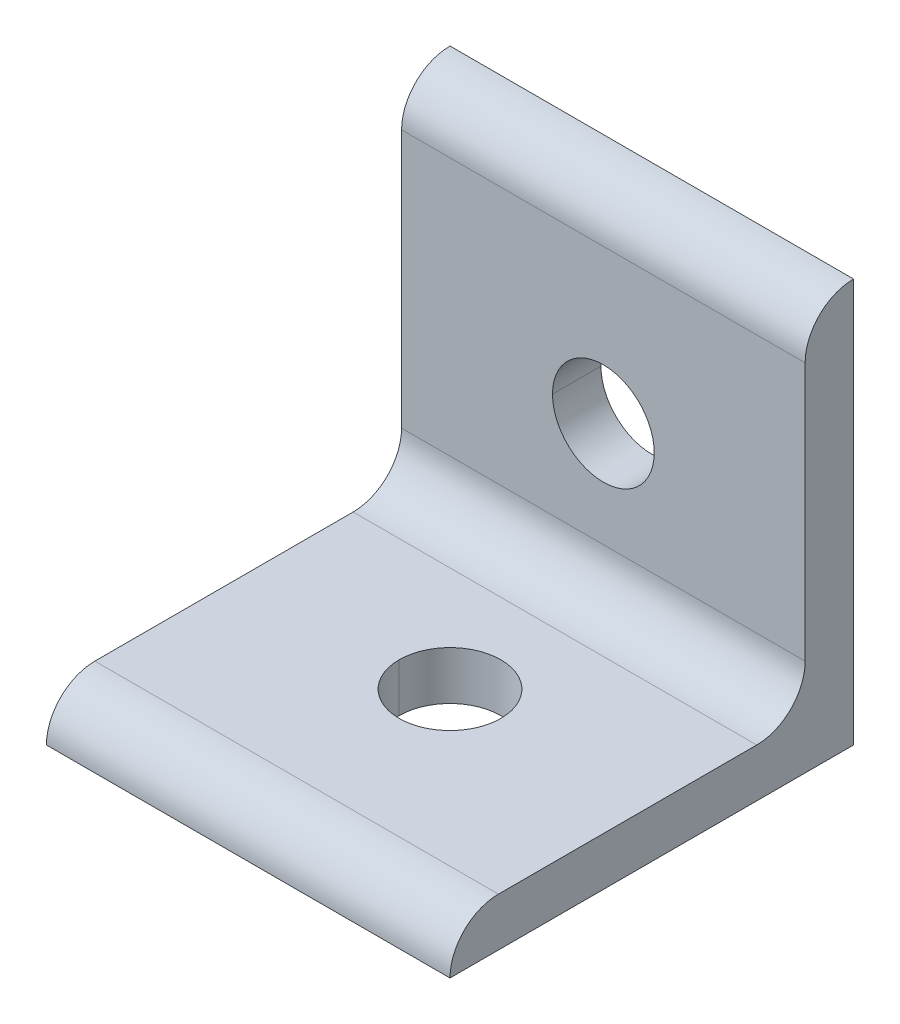
ISO-10303-21;
HEADER;
FILE_DESCRIPTION(('STEP AP214'),'2;1');
FILE_NAME('part.step','',(''),(''),'','','');
FILE_SCHEMA(('AUTOMOTIVE_DESIGN { 1 0 10303 214 1 1 1 1 }'));
ENDSEC;
DATA;
#1=APPLICATION_CONTEXT('core data for automotive mechanical design processes');
#2=APPLICATION_PROTOCOL_DEFINITION('international standard','automotive_design',2000,#1);
#3=PRODUCT_CONTEXT('',#1,'mechanical');
#4=PRODUCT('Part','Part','',(#3));
#5=PRODUCT_RELATED_PRODUCT_CATEGORY('part','',(#4));
#6=PRODUCT_DEFINITION_FORMATION('','',#4);
#7=PRODUCT_DEFINITION_CONTEXT('part definition',#1,'design');
#8=PRODUCT_DEFINITION('design','',#6,#7);
#9=PRODUCT_DEFINITION_SHAPE('','',#8);
#10=(LENGTH_UNIT() NAMED_UNIT(*) SI_UNIT(.MILLI.,.METRE.));
#11=(NAMED_UNIT(*) PLANE_ANGLE_UNIT() SI_UNIT($,.RADIAN.));
#12=(NAMED_UNIT(*) SI_UNIT($,.STERADIAN.) SOLID_ANGLE_UNIT());
#13=UNCERTAINTY_MEASURE_WITH_UNIT(LENGTH_MEASURE(1.E-05),#10,'distance_accuracy_value','');
#14=(GEOMETRIC_REPRESENTATION_CONTEXT(3) GLOBAL_UNCERTAINTY_ASSIGNED_CONTEXT((#13)) GLOBAL_UNIT_ASSIGNED_CONTEXT((#10,
#11,#12)) REPRESENTATION_CONTEXT('',''));
#15=CARTESIAN_POINT('',(0.,0.,0.));
#16=DIRECTION('',(0.,0.,1.));
#17=DIRECTION('',(1.,0.,0.));
#18=AXIS2_PLACEMENT_3D('',#15,#16,#17);
#19=CARTESIAN_POINT('',(12.5,3.,6.));
#20=DIRECTION('',(0.,-1.,0.));
#21=DIRECTION('',(0.,0.,-1.));
#22=AXIS2_PLACEMENT_3D('',#19,#20,#21);
#23=PLANE('',#22);
#24=CARTESIAN_POINT('',(0.,3.,12.5));
#25=DIRECTION('',(0.,1.,0.));
#26=DIRECTION('',(1.,0.,0.));
#27=AXIS2_PLACEMENT_3D('',#24,#25,#26);
#28=CIRCLE('',#27,3.15);
#29=CARTESIAN_POINT('',(3.15,3.,12.5));
#30=VERTEX_POINT('',#29);
#31=CARTESIAN_POINT('',(-3.15,3.,12.5));
#32=VERTEX_POINT('',#31);
#33=EDGE_CURVE('E11',#30,#32,#28,.T.);
#34=ORIENTED_EDGE('',*,*,#33,.F.);
#35=CARTESIAN_POINT('',(0.,3.,12.5));
#36=DIRECTION('',(0.,1.,0.));
#37=DIRECTION('',(1.,0.,0.));
#38=AXIS2_PLACEMENT_3D('',#35,#36,#37);
#39=CIRCLE('',#38,3.15);
#40=EDGE_CURVE('E25',#32,#30,#39,.T.);
#41=ORIENTED_EDGE('',*,*,#40,.F.);
#42=EDGE_LOOP('',(#34,#41));
#43=FACE_BOUND('',#42,.T.);
#44=DIRECTION('',(0.,0.,1.));
#45=VECTOR('',#44,1.);
#46=CARTESIAN_POINT('',(-12.5,3.,6.));
#47=LINE('',#46,#45);
#48=CARTESIAN_POINT('',(-12.5,3.,6.));
#49=VERTEX_POINT('',#48);
#50=CARTESIAN_POINT('',(-12.5,3.,22.));
#51=VERTEX_POINT('',#50);
#52=EDGE_CURVE('E220',#49,#51,#47,.T.);
#53=ORIENTED_EDGE('',*,*,#52,.T.);
#54=DIRECTION('',(-1.,0.,0.));
#55=VECTOR('',#54,1.);
#56=CARTESIAN_POINT('',(12.5,3.,22.));
#57=LINE('',#56,#55);
#58=CARTESIAN_POINT('',(12.5,3.,22.));
#59=VERTEX_POINT('',#58);
#60=EDGE_CURVE('E111',#59,#51,#57,.T.);
#61=ORIENTED_EDGE('',*,*,#60,.F.);
#62=DIRECTION('',(0.,0.,1.));
#63=VECTOR('',#62,1.);
#64=CARTESIAN_POINT('',(12.5,3.,6.));
#65=LINE('',#64,#63);
#66=CARTESIAN_POINT('',(12.5,3.,6.));
#67=VERTEX_POINT('',#66);
#68=EDGE_CURVE('E212',#67,#59,#65,.T.);
#69=ORIENTED_EDGE('',*,*,#68,.F.);
#70=DIRECTION('',(-1.,0.,0.));
#71=VECTOR('',#70,1.);
#72=CARTESIAN_POINT('',(12.5,3.,6.));
#73=LINE('',#72,#71);
#74=EDGE_CURVE('E208',#67,#49,#73,.T.);
#75=ORIENTED_EDGE('',*,*,#74,.T.);
#76=EDGE_LOOP('',(#53,#61,#69,#75));
#77=FACE_BOUND('',#76,.T.);
#78=ADVANCED_FACE('F17',(#43,#77),#23,.F.);
#79=CARTESIAN_POINT('',(12.5,6.00000000000014,6.00000000000014));
#80=DIRECTION('',(1.,0.,0.));
#81=DIRECTION('',(0.,0.707106781186531,0.707106781186564));
#82=AXIS2_PLACEMENT_3D('',#79,#80,#81);
#83=CYLINDRICAL_SURFACE('',#82,3.);
#84=DIRECTION('',(-1.,0.,0.));
#85=VECTOR('',#84,1.);
#86=CARTESIAN_POINT('',(12.5,6.,3.));
#87=LINE('',#86,#85);
#88=CARTESIAN_POINT('',(12.5,6.,3.));
#89=VERTEX_POINT('',#88);
#90=CARTESIAN_POINT('',(-12.5,6.,3.));
#91=VERTEX_POINT('',#90);
#92=EDGE_CURVE('E204',#89,#91,#87,.T.);
#93=ORIENTED_EDGE('',*,*,#92,.T.);
#94=CARTESIAN_POINT('',(-12.5,6.00000000000014,6.00000000000014));
#95=DIRECTION('',(1.,0.,0.));
#96=DIRECTION('',(0.,0.,-1.));
#97=AXIS2_PLACEMENT_3D('',#94,#95,#96);
#98=CIRCLE('',#97,3.);
#99=EDGE_CURVE('E199',#49,#91,#98,.T.);
#100=ORIENTED_EDGE('',*,*,#99,.F.);
#101=ORIENTED_EDGE('',*,*,#74,.F.);
#102=CARTESIAN_POINT('',(12.5,6.00000000000014,6.00000000000014));
#103=DIRECTION('',(1.,0.,0.));
#104=DIRECTION('',(0.,0.,-1.));
#105=AXIS2_PLACEMENT_3D('',#102,#103,#104);
#106=CIRCLE('',#105,3.);
#107=EDGE_CURVE('E195',#67,#89,#106,.T.);
#108=ORIENTED_EDGE('',*,*,#107,.T.);
#109=EDGE_LOOP('',(#93,#100,#101,#108));
#110=FACE_BOUND('',#109,.T.);
#111=ADVANCED_FACE('F278',(#110),#83,.F.);
#112=CARTESIAN_POINT('',(12.5,5.39065320159793E-13,22.0000000000005));
#113=DIRECTION('',(1.,0.,0.));
#114=DIRECTION('',(0.,0.,-1.));
#115=AXIS2_PLACEMENT_3D('',#112,#113,#114);
#116=PLANE('',#115);
#117=CARTESIAN_POINT('',(12.5,5.39065320159793E-13,22.0000000000005));
#118=DIRECTION('',(1.,0.,0.));
#119=DIRECTION('',(0.,0.,-1.));
#120=AXIS2_PLACEMENT_3D('',#117,#118,#119);
#121=CIRCLE('',#120,3.);
#122=CARTESIAN_POINT('',(12.5,0.,25.));
#123=VERTEX_POINT('',#122);
#124=EDGE_CURVE('E191',#59,#123,#121,.T.);
#125=ORIENTED_EDGE('',*,*,#124,.T.);
#126=DIRECTION('',(0.,0.,-1.));
#127=VECTOR('',#126,1.);
#128=CARTESIAN_POINT('',(12.5,0.,25.));
#129=LINE('',#128,#127);
#130=CARTESIAN_POINT('',(12.5,0.,0.));
#131=VERTEX_POINT('',#130);
#132=EDGE_CURVE('E103',#123,#131,#129,.T.);
#133=ORIENTED_EDGE('',*,*,#132,.T.);
#134=DIRECTION('',(0.,1.,0.));
#135=VECTOR('',#134,1.);
#136=CARTESIAN_POINT('',(12.5,0.,0.));
#137=LINE('',#136,#135);
#138=CARTESIAN_POINT('',(12.5,25.,0.));
#139=VERTEX_POINT('',#138);
#140=EDGE_CURVE('E184',#131,#139,#137,.T.);
#141=ORIENTED_EDGE('',*,*,#140,.T.);
#142=CARTESIAN_POINT('',(12.5,22.0000000000005,5.38631639290799E-13));
#143=DIRECTION('',(1.,0.,0.));
#144=DIRECTION('',(0.,0.,-1.));
#145=AXIS2_PLACEMENT_3D('',#142,#143,#144);
#146=CIRCLE('',#145,3.);
#147=CARTESIAN_POINT('',(12.5,22.,3.));
#148=VERTEX_POINT('',#147);
#149=EDGE_CURVE('E180',#139,#148,#146,.T.);
#150=ORIENTED_EDGE('',*,*,#149,.T.);
#151=DIRECTION('',(0.,-1.,0.));
#152=VECTOR('',#151,1.);
#153=CARTESIAN_POINT('',(12.5,22.,3.));
#154=LINE('',#153,#152);
#155=EDGE_CURVE('E175',#148,#89,#154,.T.);
#156=ORIENTED_EDGE('',*,*,#155,.T.);
#157=ORIENTED_EDGE('',*,*,#107,.F.);
#158=ORIENTED_EDGE('',*,*,#68,.T.);
#159=EDGE_LOOP('',(#125,#133,#141,#150,#156,#157,#158));
#160=FACE_BOUND('',#159,.T.);
#161=ADVANCED_FACE('F269',(#160),#116,.T.);
#162=CARTESIAN_POINT('',(12.5,22.,3.));
#163=DIRECTION('',(0.,0.,-1.));
#164=DIRECTION('',(-1.,0.,0.));
#165=AXIS2_PLACEMENT_3D('',#162,#163,#164);
#166=PLANE('',#165);
#167=CARTESIAN_POINT('',(0.,12.5,3.));
#168=DIRECTION('',(0.,0.,1.));
#169=DIRECTION('',(1.,0.,0.));
#170=AXIS2_PLACEMENT_3D('',#167,#168,#169);
#171=CIRCLE('',#170,3.15);
#172=CARTESIAN_POINT('',(3.15,12.5,3.));
#173=VERTEX_POINT('',#172);
#174=CARTESIAN_POINT('',(-3.15,12.5,3.));
#175=VERTEX_POINT('',#174);
#176=EDGE_CURVE('E170',#173,#175,#171,.T.);
#177=ORIENTED_EDGE('',*,*,#176,.F.);
#178=CARTESIAN_POINT('',(0.,12.5,3.));
#179=DIRECTION('',(0.,0.,1.));
#180=DIRECTION('',(1.,0.,0.));
#181=AXIS2_PLACEMENT_3D('',#178,#179,#180);
#182=CIRCLE('',#181,3.15);
#183=EDGE_CURVE('E165',#175,#173,#182,.T.);
#184=ORIENTED_EDGE('',*,*,#183,.F.);
#185=EDGE_LOOP('',(#177,#184));
#186=FACE_BOUND('',#185,.T.);
#187=DIRECTION('',(0.,-1.,0.));
#188=VECTOR('',#187,1.);
#189=CARTESIAN_POINT('',(-12.5,22.,3.));
#190=LINE('',#189,#188);
#191=CARTESIAN_POINT('',(-12.5,22.,3.));
#192=VERTEX_POINT('',#191);
#193=EDGE_CURVE('E160',#192,#91,#190,.T.);
#194=ORIENTED_EDGE('',*,*,#193,.T.);
#195=ORIENTED_EDGE('',*,*,#92,.F.);
#196=ORIENTED_EDGE('',*,*,#155,.F.);
#197=DIRECTION('',(-1.,0.,0.));
#198=VECTOR('',#197,1.);
#199=CARTESIAN_POINT('',(12.5,22.,3.));
#200=LINE('',#199,#198);
#201=EDGE_CURVE('E156',#148,#192,#200,.T.);
#202=ORIENTED_EDGE('',*,*,#201,.T.);
#203=EDGE_LOOP('',(#194,#195,#196,#202));
#204=FACE_BOUND('',#203,.T.);
#205=ADVANCED_FACE('F265',(#186,#204),#166,.F.);
#206=CARTESIAN_POINT('',(12.5,22.0000000000005,5.38631639290799E-13));
#207=DIRECTION('',(1.,0.,0.));
#208=DIRECTION('',(0.,-0.707106781186552,-0.707106781186543));
#209=AXIS2_PLACEMENT_3D('',#206,#207,#208);
#210=CYLINDRICAL_SURFACE('',#209,3.);
#211=CARTESIAN_POINT('',(-12.5,22.0000000000005,5.38631639290799E-13));
#212=DIRECTION('',(1.,0.,0.));
#213=DIRECTION('',(0.,0.,-1.));
#214=AXIS2_PLACEMENT_3D('',#211,#212,#213);
#215=CIRCLE('',#214,3.);
#216=CARTESIAN_POINT('',(-12.5,25.,0.));
#217=VERTEX_POINT('',#216);
#218=EDGE_CURVE('E151',#217,#192,#215,.T.);
#219=ORIENTED_EDGE('',*,*,#218,.T.);
#220=ORIENTED_EDGE('',*,*,#201,.F.);
#221=ORIENTED_EDGE('',*,*,#149,.F.);
#222=DIRECTION('',(-1.,0.,0.));
#223=VECTOR('',#222,1.);
#224=CARTESIAN_POINT('',(12.5,25.,0.));
#225=LINE('',#224,#223);
#226=EDGE_CURVE('E147',#139,#217,#225,.T.);
#227=ORIENTED_EDGE('',*,*,#226,.T.);
#228=EDGE_LOOP('',(#219,#220,#221,#227));
#229=FACE_BOUND('',#228,.T.);
#230=ADVANCED_FACE('F268',(#229),#210,.T.);
#231=CARTESIAN_POINT('',(12.5,0.,0.));
#232=DIRECTION('',(0.,0.,1.));
#233=DIRECTION('',(1.,0.,0.));
#234=AXIS2_PLACEMENT_3D('',#231,#232,#233);
#235=PLANE('',#234);
#236=CARTESIAN_POINT('',(0.,12.5,0.));
#237=DIRECTION('',(0.,0.,1.));
#238=DIRECTION('',(1.,0.,0.));
#239=AXIS2_PLACEMENT_3D('',#236,#237,#238);
#240=CIRCLE('',#239,3.15);
#241=CARTESIAN_POINT('',(3.15,12.5,0.));
#242=VERTEX_POINT('',#241);
#243=CARTESIAN_POINT('',(-3.15,12.5,0.));
#244=VERTEX_POINT('',#243);
#245=EDGE_CURVE('E143',#242,#244,#240,.T.);
#246=ORIENTED_EDGE('',*,*,#245,.T.);
#247=CARTESIAN_POINT('',(0.,12.5,0.));
#248=DIRECTION('',(0.,0.,1.));
#249=DIRECTION('',(1.,0.,0.));
#250=AXIS2_PLACEMENT_3D('',#247,#248,#249);
#251=CIRCLE('',#250,3.15);
#252=EDGE_CURVE('E139',#244,#242,#251,.T.);
#253=ORIENTED_EDGE('',*,*,#252,.T.);
#254=EDGE_LOOP('',(#246,#253));
#255=FACE_BOUND('',#254,.T.);
#256=DIRECTION('',(0.,1.,0.));
#257=VECTOR('',#256,1.);
#258=CARTESIAN_POINT('',(-12.5,0.,0.));
#259=LINE('',#258,#257);
#260=CARTESIAN_POINT('',(-12.5,0.,0.));
#261=VERTEX_POINT('',#260);
#262=EDGE_CURVE('E119',#261,#217,#259,.T.);
#263=ORIENTED_EDGE('',*,*,#262,.T.);
#264=ORIENTED_EDGE('',*,*,#226,.F.);
#265=ORIENTED_EDGE('',*,*,#140,.F.);
#266=DIRECTION('',(-1.,0.,0.));
#267=VECTOR('',#266,1.);
#268=CARTESIAN_POINT('',(12.5,0.,0.));
#269=LINE('',#268,#267);
#270=EDGE_CURVE('E132',#131,#261,#269,.T.);
#271=ORIENTED_EDGE('',*,*,#270,.T.);
#272=EDGE_LOOP('',(#263,#264,#265,#271));
#273=FACE_BOUND('',#272,.T.);
#274=ADVANCED_FACE('F286',(#255,#273),#235,.F.);
#275=CARTESIAN_POINT('',(12.5,0.,25.));
#276=DIRECTION('',(0.,1.,0.));
#277=DIRECTION('',(0.,0.,1.));
#278=AXIS2_PLACEMENT_3D('',#275,#276,#277);
#279=PLANE('',#278);
#280=CARTESIAN_POINT('',(0.,0.,12.5));
#281=DIRECTION('',(0.,1.,0.));
#282=DIRECTION('',(1.,0.,0.));
#283=AXIS2_PLACEMENT_3D('',#280,#281,#282);
#284=CIRCLE('',#283,3.15);
#285=CARTESIAN_POINT('',(3.15,0.,12.5));
#286=VERTEX_POINT('',#285);
#287=CARTESIAN_POINT('',(-3.15,0.,12.5));
#288=VERTEX_POINT('',#287);
#289=EDGE_CURVE('E122',#286,#288,#284,.T.);
#290=ORIENTED_EDGE('',*,*,#289,.T.);
#291=CARTESIAN_POINT('',(0.,0.,12.5));
#292=DIRECTION('',(0.,1.,0.));
#293=DIRECTION('',(1.,0.,0.));
#294=AXIS2_PLACEMENT_3D('',#291,#292,#293);
#295=CIRCLE('',#294,3.15);
#296=EDGE_CURVE('E120',#288,#286,#295,.T.);
#297=ORIENTED_EDGE('',*,*,#296,.T.);
#298=EDGE_LOOP('',(#290,#297));
#299=FACE_BOUND('',#298,.T.);
#300=DIRECTION('',(0.,0.,-1.));
#301=VECTOR('',#300,1.);
#302=CARTESIAN_POINT('',(-12.5,0.,25.));
#303=LINE('',#302,#301);
#304=CARTESIAN_POINT('',(-12.5,0.,25.));
#305=VERTEX_POINT('',#304);
#306=EDGE_CURVE('E101',#305,#261,#303,.T.);
#307=ORIENTED_EDGE('',*,*,#306,.T.);
#308=ORIENTED_EDGE('',*,*,#270,.F.);
#309=ORIENTED_EDGE('',*,*,#132,.F.);
#310=DIRECTION('',(-1.,0.,0.));
#311=VECTOR('',#310,1.);
#312=CARTESIAN_POINT('',(12.5,0.,25.));
#313=LINE('',#312,#311);
#314=EDGE_CURVE('E96',#123,#305,#313,.T.);
#315=ORIENTED_EDGE('',*,*,#314,.T.);
#316=EDGE_LOOP('',(#307,#308,#309,#315));
#317=FACE_BOUND('',#316,.T.);
#318=ADVANCED_FACE('F98',(#299,#317),#279,.F.);
#319=CARTESIAN_POINT('',(12.5,5.39065320159793E-13,22.0000000000005));
#320=DIRECTION('',(1.,0.,0.));
#321=DIRECTION('',(0.,-0.707106781186543,-0.707106781186552));
#322=AXIS2_PLACEMENT_3D('',#319,#320,#321);
#323=CYLINDRICAL_SURFACE('',#322,3.);
#324=CARTESIAN_POINT('',(-12.5,5.39065320159793E-13,22.0000000000005));
#325=DIRECTION('',(1.,0.,0.));
#326=DIRECTION('',(0.,0.,-1.));
#327=AXIS2_PLACEMENT_3D('',#324,#325,#326);
#328=CIRCLE('',#327,3.);
#329=EDGE_CURVE('E106',#51,#305,#328,.T.);
#330=ORIENTED_EDGE('',*,*,#329,.T.);
#331=ORIENTED_EDGE('',*,*,#314,.F.);
#332=ORIENTED_EDGE('',*,*,#124,.F.);
#333=ORIENTED_EDGE('',*,*,#60,.T.);
#334=EDGE_LOOP('',(#330,#331,#332,#333));
#335=FACE_BOUND('',#334,.T.);
#336=ADVANCED_FACE('F110',(#335),#323,.T.);
#337=CARTESIAN_POINT('',(-12.5,5.39065320159793E-13,22.0000000000005));
#338=DIRECTION('',(1.,0.,0.));
#339=DIRECTION('',(0.,0.,-1.));
#340=AXIS2_PLACEMENT_3D('',#337,#338,#339);
#341=PLANE('',#340);
#342=ORIENTED_EDGE('',*,*,#329,.F.);
#343=ORIENTED_EDGE('',*,*,#52,.F.);
#344=ORIENTED_EDGE('',*,*,#99,.T.);
#345=ORIENTED_EDGE('',*,*,#193,.F.);
#346=ORIENTED_EDGE('',*,*,#218,.F.);
#347=ORIENTED_EDGE('',*,*,#262,.F.);
#348=ORIENTED_EDGE('',*,*,#306,.F.);
#349=EDGE_LOOP('',(#342,#343,#344,#345,#346,#347,#348));
#350=FACE_BOUND('',#349,.T.);
#351=ADVANCED_FACE('F116',(#350),#341,.F.);
#352=CARTESIAN_POINT('',(0.,3.,12.5));
#353=DIRECTION('',(0.,1.,0.));
#354=DIRECTION('',(0.,0.,-1.));
#355=AXIS2_PLACEMENT_3D('',#352,#353,#354);
#356=CYLINDRICAL_SURFACE('',#355,3.15);
#357=ORIENTED_EDGE('',*,*,#296,.F.);
#358=DIRECTION('',(0.,1.,0.));
#359=VECTOR('',#358,1.);
#360=CARTESIAN_POINT('',(-3.15,0.,12.5));
#361=LINE('',#360,#359);
#362=EDGE_CURVE('E114',#288,#32,#361,.T.);
#363=ORIENTED_EDGE('',*,*,#362,.T.);
#364=ORIENTED_EDGE('',*,*,#40,.T.);
#365=DIRECTION('',(0.,1.,0.));
#366=VECTOR('',#365,1.);
#367=CARTESIAN_POINT('',(3.15,0.,12.5));
#368=LINE('',#367,#366);
#369=EDGE_CURVE('E233',#286,#30,#368,.T.);
#370=ORIENTED_EDGE('',*,*,#369,.F.);
#371=EDGE_LOOP('',(#357,#363,#364,#370));
#372=FACE_BOUND('',#371,.T.);
#373=ADVANCED_FACE('F232',(#372),#356,.F.);
#374=CARTESIAN_POINT('',(0.,3.,12.5));
#375=DIRECTION('',(0.,1.,0.));
#376=DIRECTION('',(0.,0.,1.));
#377=AXIS2_PLACEMENT_3D('',#374,#375,#376);
#378=CYLINDRICAL_SURFACE('',#377,3.15);
#379=ORIENTED_EDGE('',*,*,#33,.T.);
#380=ORIENTED_EDGE('',*,*,#362,.F.);
#381=ORIENTED_EDGE('',*,*,#289,.F.);
#382=ORIENTED_EDGE('',*,*,#369,.T.);
#383=EDGE_LOOP('',(#379,#380,#381,#382));
#384=FACE_BOUND('',#383,.T.);
#385=ADVANCED_FACE('F237',(#384),#378,.F.);
#386=CARTESIAN_POINT('',(0.,12.5,3.));
#387=DIRECTION('',(0.,0.,1.));
#388=DIRECTION('',(0.,1.,0.));
#389=AXIS2_PLACEMENT_3D('',#386,#387,#388);
#390=CYLINDRICAL_SURFACE('',#389,3.15);
#391=ORIENTED_EDGE('',*,*,#252,.F.);
#392=DIRECTION('',(0.,0.,1.));
#393=VECTOR('',#392,1.);
#394=CARTESIAN_POINT('',(-3.15,12.5,0.));
#395=LINE('',#394,#393);
#396=EDGE_CURVE('E238',#244,#175,#395,.T.);
#397=ORIENTED_EDGE('',*,*,#396,.T.);
#398=ORIENTED_EDGE('',*,*,#183,.T.);
#399=DIRECTION('',(0.,0.,1.));
#400=VECTOR('',#399,1.);
#401=CARTESIAN_POINT('',(3.15,12.5,0.));
#402=LINE('',#401,#400);
#403=EDGE_CURVE('E242',#242,#173,#402,.T.);
#404=ORIENTED_EDGE('',*,*,#403,.F.);
#405=EDGE_LOOP('',(#391,#397,#398,#404));
#406=FACE_BOUND('',#405,.T.);
#407=ADVANCED_FACE('F263',(#406),#390,.F.);
#408=CARTESIAN_POINT('',(0.,12.5,3.));
#409=DIRECTION('',(0.,0.,1.));
#410=DIRECTION('',(0.,-1.,0.));
#411=AXIS2_PLACEMENT_3D('',#408,#409,#410);
#412=CYLINDRICAL_SURFACE('',#411,3.15);
#413=ORIENTED_EDGE('',*,*,#176,.T.);
#414=ORIENTED_EDGE('',*,*,#396,.F.);
#415=ORIENTED_EDGE('',*,*,#245,.F.);
#416=ORIENTED_EDGE('',*,*,#403,.T.);
#417=EDGE_LOOP('',(#413,#414,#415,#416));
#418=FACE_BOUND('',#417,.T.);
#419=ADVANCED_FACE('F259',(#418),#412,.F.);
#420=CLOSED_SHELL('',(#78,#111,#161,#205,#230,#274,#318,#336,#351,#373,#385,#407,#419));
#421=MANIFOLD_SOLID_BREP('B1',#420);
#422=ADVANCED_BREP_SHAPE_REPRESENTATION('',(#18,#421),#14);
#423=SHAPE_DEFINITION_REPRESENTATION(#9,#422);
ENDSEC;
END-ISO-10303-21;
